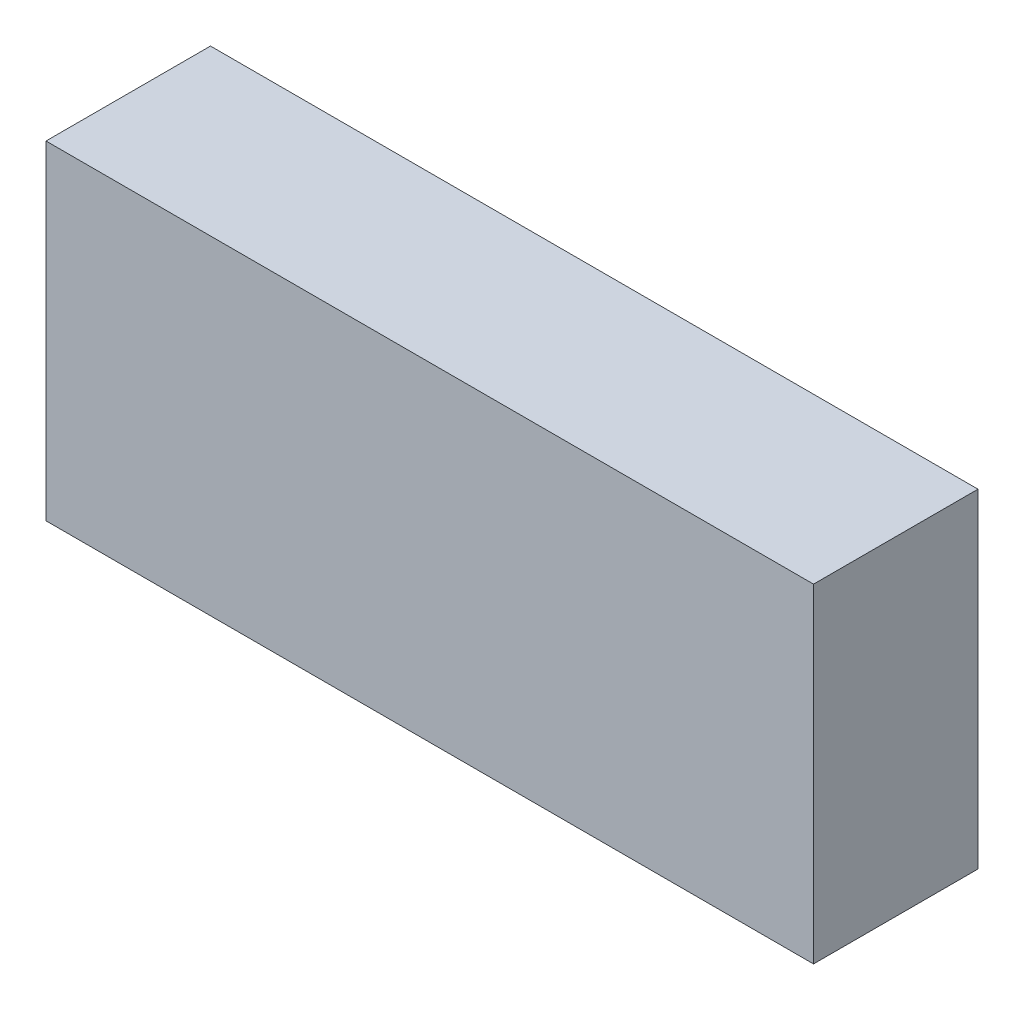
ISO-10303-21;
HEADER;
FILE_DESCRIPTION(('STEP AP214'),'2;1');
FILE_NAME('part.step','',(''),(''),'','','');
FILE_SCHEMA(('AUTOMOTIVE_DESIGN { 1 0 10303 214 1 1 1 1 }'));
ENDSEC;
DATA;
#1=APPLICATION_CONTEXT('core data for automotive mechanical design processes');
#2=APPLICATION_PROTOCOL_DEFINITION('international standard','automotive_design',2000,#1);
#3=PRODUCT_CONTEXT('',#1,'mechanical');
#4=PRODUCT('Part','Part','',(#3));
#5=PRODUCT_RELATED_PRODUCT_CATEGORY('part','',(#4));
#6=PRODUCT_DEFINITION_FORMATION('','',#4);
#7=PRODUCT_DEFINITION_CONTEXT('part definition',#1,'design');
#8=PRODUCT_DEFINITION('design','',#6,#7);
#9=PRODUCT_DEFINITION_SHAPE('','',#8);
#10=(LENGTH_UNIT() NAMED_UNIT(*) SI_UNIT(.MILLI.,.METRE.));
#11=(NAMED_UNIT(*) PLANE_ANGLE_UNIT() SI_UNIT($,.RADIAN.));
#12=(NAMED_UNIT(*) SI_UNIT($,.STERADIAN.) SOLID_ANGLE_UNIT());
#13=UNCERTAINTY_MEASURE_WITH_UNIT(LENGTH_MEASURE(1.E-05),#10,'distance_accuracy_value','');
#14=(GEOMETRIC_REPRESENTATION_CONTEXT(3) GLOBAL_UNCERTAINTY_ASSIGNED_CONTEXT((#13)) GLOBAL_UNIT_ASSIGNED_CONTEXT((#10,
#11,#12)) REPRESENTATION_CONTEXT('',''));
#15=CARTESIAN_POINT('',(0.,0.,0.));
#16=DIRECTION('',(0.,0.,1.));
#17=DIRECTION('',(1.,0.,0.));
#18=AXIS2_PLACEMENT_3D('',#15,#16,#17);
#19=CARTESIAN_POINT('',(0.,0.,45.));
#20=DIRECTION('',(0.,0.,1.));
#21=DIRECTION('',(1.,0.,0.));
#22=AXIS2_PLACEMENT_3D('',#19,#20,#21);
#23=PLANE('',#22);
#24=DIRECTION('',(-1.,0.,0.));
#25=VECTOR('',#24,1.);
#26=CARTESIAN_POINT('',(0.,-45.,45.));
#27=LINE('',#26,#25);
#28=CARTESIAN_POINT('',(105.,-45.,45.));
#29=VERTEX_POINT('',#28);
#30=CARTESIAN_POINT('',(-105.,-45.,45.));
#31=VERTEX_POINT('',#30);
#32=EDGE_CURVE('E11',#29,#31,#27,.T.);
#33=ORIENTED_EDGE('',*,*,#32,.F.);
#34=DIRECTION('',(0.,-1.,0.));
#35=VECTOR('',#34,1.);
#36=CARTESIAN_POINT('',(105.,0.,45.));
#37=LINE('',#36,#35);
#38=CARTESIAN_POINT('',(105.,45.,45.));
#39=VERTEX_POINT('',#38);
#40=EDGE_CURVE('E62',#39,#29,#37,.T.);
#41=ORIENTED_EDGE('',*,*,#40,.F.);
#42=DIRECTION('',(1.,0.,0.));
#43=VECTOR('',#42,1.);
#44=CARTESIAN_POINT('',(0.,45.,45.));
#45=LINE('',#44,#43);
#46=CARTESIAN_POINT('',(-105.,45.,45.));
#47=VERTEX_POINT('',#46);
#48=EDGE_CURVE('E99',#47,#39,#45,.T.);
#49=ORIENTED_EDGE('',*,*,#48,.F.);
#50=DIRECTION('',(0.,1.,0.));
#51=VECTOR('',#50,1.);
#52=CARTESIAN_POINT('',(-105.,0.,45.));
#53=LINE('',#52,#51);
#54=EDGE_CURVE('E25',#31,#47,#53,.T.);
#55=ORIENTED_EDGE('',*,*,#54,.F.);
#56=EDGE_LOOP('',(#33,#41,#49,#55));
#57=FACE_BOUND('',#56,.T.);
#58=ADVANCED_FACE('F17',(#57),#23,.T.);
#59=CARTESIAN_POINT('',(0.,-45.,0.));
#60=DIRECTION('',(0.,-1.,0.));
#61=DIRECTION('',(0.,0.,-1.));
#62=AXIS2_PLACEMENT_3D('',#59,#60,#61);
#63=PLANE('',#62);
#64=DIRECTION('',(0.,0.,1.));
#65=VECTOR('',#64,1.);
#66=CARTESIAN_POINT('',(105.,-45.,0.));
#67=LINE('',#66,#65);
#68=CARTESIAN_POINT('',(105.,-45.,0.));
#69=VERTEX_POINT('',#68);
#70=EDGE_CURVE('E55',#69,#29,#67,.T.);
#71=ORIENTED_EDGE('',*,*,#70,.T.);
#72=ORIENTED_EDGE('',*,*,#32,.T.);
#73=DIRECTION('',(0.,0.,1.));
#74=VECTOR('',#73,1.);
#75=CARTESIAN_POINT('',(-105.,-45.,0.));
#76=LINE('',#75,#74);
#77=CARTESIAN_POINT('',(-105.,-45.,0.));
#78=VERTEX_POINT('',#77);
#79=EDGE_CURVE('E69',#78,#31,#76,.T.);
#80=ORIENTED_EDGE('',*,*,#79,.F.);
#81=DIRECTION('',(1.,0.,0.));
#82=VECTOR('',#81,1.);
#83=CARTESIAN_POINT('',(0.,-45.,0.));
#84=LINE('',#83,#82);
#85=EDGE_CURVE('E67',#78,#69,#84,.T.);
#86=ORIENTED_EDGE('',*,*,#85,.T.);
#87=EDGE_LOOP('',(#71,#72,#80,#86));
#88=FACE_BOUND('',#87,.T.);
#89=ADVANCED_FACE('F68',(#88),#63,.T.);
#90=CARTESIAN_POINT('',(-105.,0.,0.));
#91=DIRECTION('',(-1.,0.,0.));
#92=DIRECTION('',(0.,0.,1.));
#93=AXIS2_PLACEMENT_3D('',#90,#91,#92);
#94=PLANE('',#93);
#95=ORIENTED_EDGE('',*,*,#79,.T.);
#96=ORIENTED_EDGE('',*,*,#54,.T.);
#97=DIRECTION('',(0.,0.,1.));
#98=VECTOR('',#97,1.);
#99=CARTESIAN_POINT('',(-105.,45.,0.));
#100=LINE('',#99,#98);
#101=CARTESIAN_POINT('',(-105.,45.,0.));
#102=VERTEX_POINT('',#101);
#103=EDGE_CURVE('E91',#102,#47,#100,.T.);
#104=ORIENTED_EDGE('',*,*,#103,.F.);
#105=DIRECTION('',(0.,-1.,0.));
#106=VECTOR('',#105,1.);
#107=CARTESIAN_POINT('',(-105.,0.,0.));
#108=LINE('',#107,#106);
#109=EDGE_CURVE('E74',#102,#78,#108,.T.);
#110=ORIENTED_EDGE('',*,*,#109,.T.);
#111=EDGE_LOOP('',(#95,#96,#104,#110));
#112=FACE_BOUND('',#111,.T.);
#113=ADVANCED_FACE('F106',(#112),#94,.T.);
#114=CARTESIAN_POINT('',(0.,45.,0.));
#115=DIRECTION('',(0.,1.,0.));
#116=DIRECTION('',(0.,0.,1.));
#117=AXIS2_PLACEMENT_3D('',#114,#115,#116);
#118=PLANE('',#117);
#119=ORIENTED_EDGE('',*,*,#103,.T.);
#120=ORIENTED_EDGE('',*,*,#48,.T.);
#121=DIRECTION('',(0.,0.,1.));
#122=VECTOR('',#121,1.);
#123=CARTESIAN_POINT('',(105.,45.,0.));
#124=LINE('',#123,#122);
#125=CARTESIAN_POINT('',(105.,45.,0.));
#126=VERTEX_POINT('',#125);
#127=EDGE_CURVE('E64',#126,#39,#124,.T.);
#128=ORIENTED_EDGE('',*,*,#127,.F.);
#129=DIRECTION('',(-1.,0.,0.));
#130=VECTOR('',#129,1.);
#131=CARTESIAN_POINT('',(0.,45.,0.));
#132=LINE('',#131,#130);
#133=EDGE_CURVE('E79',#126,#102,#132,.T.);
#134=ORIENTED_EDGE('',*,*,#133,.T.);
#135=EDGE_LOOP('',(#119,#120,#128,#134));
#136=FACE_BOUND('',#135,.T.);
#137=ADVANCED_FACE('F104',(#136),#118,.T.);
#138=CARTESIAN_POINT('',(0.,0.,0.));
#139=DIRECTION('',(0.,0.,-1.));
#140=DIRECTION('',(-1.,0.,0.));
#141=AXIS2_PLACEMENT_3D('',#138,#139,#140);
#142=PLANE('',#141);
#143=DIRECTION('',(0.,1.,0.));
#144=VECTOR('',#143,1.);
#145=CARTESIAN_POINT('',(105.,0.,0.));
#146=LINE('',#145,#144);
#147=EDGE_CURVE('E60',#69,#126,#146,.T.);
#148=ORIENTED_EDGE('',*,*,#147,.F.);
#149=ORIENTED_EDGE('',*,*,#85,.F.);
#150=ORIENTED_EDGE('',*,*,#109,.F.);
#151=ORIENTED_EDGE('',*,*,#133,.F.);
#152=EDGE_LOOP('',(#148,#149,#150,#151));
#153=FACE_BOUND('',#152,.T.);
#154=ADVANCED_FACE('F77',(#153),#142,.T.);
#155=CARTESIAN_POINT('',(105.,0.,0.));
#156=DIRECTION('',(1.,0.,0.));
#157=DIRECTION('',(0.,0.,-1.));
#158=AXIS2_PLACEMENT_3D('',#155,#156,#157);
#159=PLANE('',#158);
#160=ORIENTED_EDGE('',*,*,#147,.T.);
#161=ORIENTED_EDGE('',*,*,#127,.T.);
#162=ORIENTED_EDGE('',*,*,#40,.T.);
#163=ORIENTED_EDGE('',*,*,#70,.F.);
#164=EDGE_LOOP('',(#160,#161,#162,#163));
#165=FACE_BOUND('',#164,.T.);
#166=ADVANCED_FACE('F57',(#165),#159,.T.);
#167=CLOSED_SHELL('',(#58,#89,#113,#137,#154,#166));
#168=MANIFOLD_SOLID_BREP('B1',#167);
#169=ADVANCED_BREP_SHAPE_REPRESENTATION('',(#18,#168),#14);
#170=SHAPE_DEFINITION_REPRESENTATION(#9,#169);
ENDSEC;
END-ISO-10303-21;
